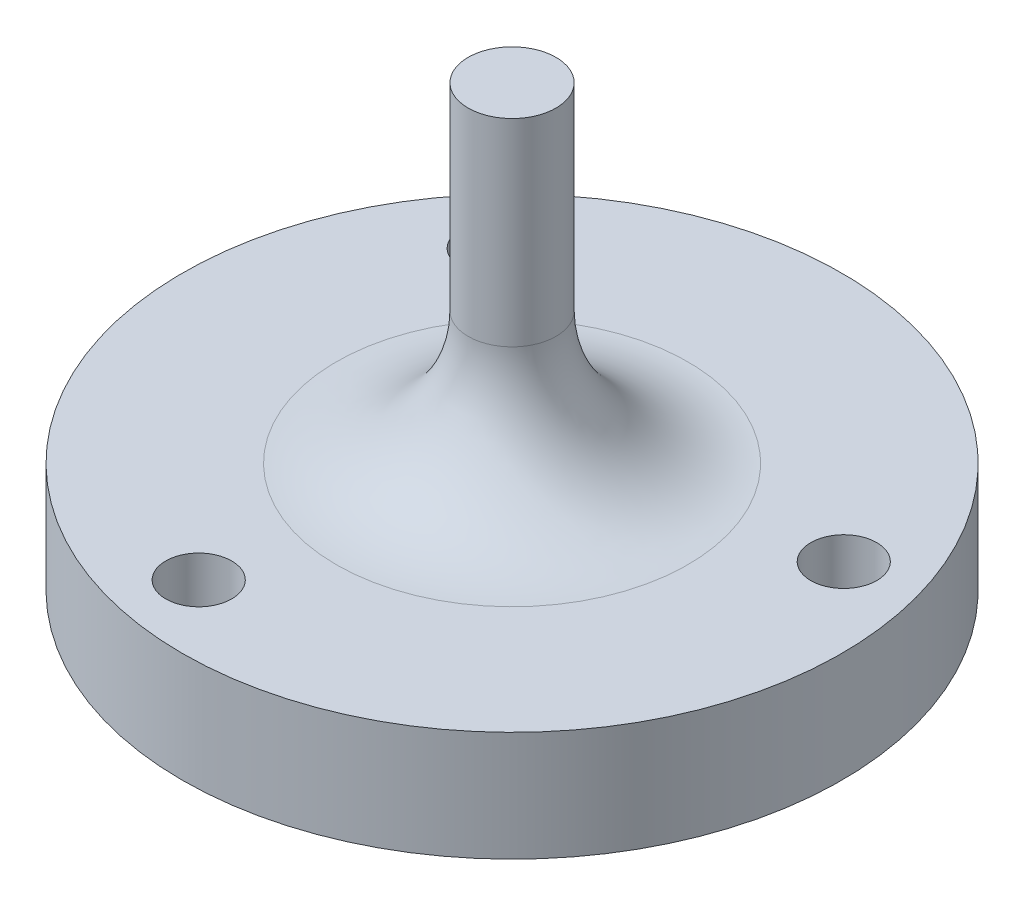
ISO-10303-21;
HEADER;
FILE_DESCRIPTION(('STEP AP214'),'2;1');
FILE_NAME('part.step','',(''),(''),'','','');
FILE_SCHEMA(('AUTOMOTIVE_DESIGN { 1 0 10303 214 1 1 1 1 }'));
ENDSEC;
DATA;
#1=APPLICATION_CONTEXT('core data for automotive mechanical design processes');
#2=APPLICATION_PROTOCOL_DEFINITION('international standard','automotive_design',2000,#1);
#3=PRODUCT_CONTEXT('',#1,'mechanical');
#4=PRODUCT('Part','Part','',(#3));
#5=PRODUCT_RELATED_PRODUCT_CATEGORY('part','',(#4));
#6=PRODUCT_DEFINITION_FORMATION('','',#4);
#7=PRODUCT_DEFINITION_CONTEXT('part definition',#1,'design');
#8=PRODUCT_DEFINITION('design','',#6,#7);
#9=PRODUCT_DEFINITION_SHAPE('','',#8);
#10=(LENGTH_UNIT() NAMED_UNIT(*) SI_UNIT(.MILLI.,.METRE.));
#11=(NAMED_UNIT(*) PLANE_ANGLE_UNIT() SI_UNIT($,.RADIAN.));
#12=(NAMED_UNIT(*) SI_UNIT($,.STERADIAN.) SOLID_ANGLE_UNIT());
#13=UNCERTAINTY_MEASURE_WITH_UNIT(LENGTH_MEASURE(1.E-05),#10,'distance_accuracy_value','');
#14=(GEOMETRIC_REPRESENTATION_CONTEXT(3) GLOBAL_UNCERTAINTY_ASSIGNED_CONTEXT((#13)) GLOBAL_UNIT_ASSIGNED_CONTEXT((#10,
#11,#12)) REPRESENTATION_CONTEXT('',''));
#15=CARTESIAN_POINT('',(0.,0.,0.));
#16=DIRECTION('',(0.,0.,1.));
#17=DIRECTION('',(1.,0.,0.));
#18=AXIS2_PLACEMENT_3D('',#15,#16,#17);
#19=CARTESIAN_POINT('',(0.,5.,0.));
#20=DIRECTION('',(0.,-1.,0.));
#21=DIRECTION('',(0.,0.,-1.));
#22=AXIS2_PLACEMENT_3D('',#19,#20,#21);
#23=CYLINDRICAL_SURFACE('',#22,15.);
#24=CARTESIAN_POINT('',(0.,5.,0.));
#25=DIRECTION('',(0.,1.,0.));
#26=DIRECTION('',(0.,0.,1.));
#27=AXIS2_PLACEMENT_3D('',#24,#25,#26);
#28=CIRCLE('',#27,15.);
#29=CARTESIAN_POINT('',(0.,5.,15.));
#30=VERTEX_POINT('',#29);
#31=EDGE_CURVE('E42',#30,#30,#28,.T.);
#32=ORIENTED_EDGE('',*,*,#31,.F.);
#33=EDGE_LOOP('',(#32));
#34=FACE_BOUND('',#33,.T.);
#35=CARTESIAN_POINT('',(0.,0.,0.));
#36=DIRECTION('',(0.,1.,0.));
#37=DIRECTION('',(0.,0.,1.));
#38=AXIS2_PLACEMENT_3D('',#35,#36,#37);
#39=CIRCLE('',#38,15.);
#40=CARTESIAN_POINT('',(0.,0.,15.));
#41=VERTEX_POINT('',#40);
#42=EDGE_CURVE('E46',#41,#41,#39,.T.);
#43=ORIENTED_EDGE('',*,*,#42,.T.);
#44=EDGE_LOOP('',(#43));
#45=FACE_BOUND('',#44,.T.);
#46=ADVANCED_FACE('F31',(#34,#45),#23,.T.);
#47=CARTESIAN_POINT('',(0.,5.,0.));
#48=DIRECTION('',(0.,1.,0.));
#49=DIRECTION('',(0.,0.,1.));
#50=AXIS2_PLACEMENT_3D('',#47,#48,#49);
#51=PLANE('',#50);
#52=CARTESIAN_POINT('',(-8.89226860724913,5.,-8.05776389679741));
#53=DIRECTION('',(0.,1.,0.));
#54=DIRECTION('',(-0.866025403784436,0.,-0.500000000000004));
#55=AXIS2_PLACEMENT_3D('',#52,#53,#54);
#56=CIRCLE('',#55,1.5);
#57=CARTESIAN_POINT('',(-10.1913067129258,5.,-8.80776389679741));
#58=VERTEX_POINT('',#57);
#59=EDGE_CURVE('E67',#58,#58,#56,.T.);
#60=ORIENTED_EDGE('',*,*,#59,.F.);
#61=EDGE_LOOP('',(#60));
#62=FACE_BOUND('',#61,.T.);
#63=CARTESIAN_POINT('',(11.4243625359482,5.,-3.67204856275385));
#64=DIRECTION('',(0.,1.,0.));
#65=DIRECTION('',(0.866025403784443,0.,-0.499999999999992));
#66=AXIS2_PLACEMENT_3D('',#63,#64,#65);
#67=CIRCLE('',#66,1.5);
#68=CARTESIAN_POINT('',(12.7234006416249,5.,-4.42204856275384));
#69=VERTEX_POINT('',#68);
#70=EDGE_CURVE('E61',#69,#69,#67,.T.);
#71=ORIENTED_EDGE('',*,*,#70,.F.);
#72=EDGE_LOOP('',(#71));
#73=FACE_BOUND('',#72,.T.);
#74=CARTESIAN_POINT('',(-2.53209392869903,5.,11.7298124595513));
#75=DIRECTION('',(0.,1.,0.));
#76=DIRECTION('',(0.,0.,1.));
#77=AXIS2_PLACEMENT_3D('',#74,#75,#76);
#78=CIRCLE('',#77,1.5);
#79=CARTESIAN_POINT('',(-2.53209392869903,5.,13.2298124595513));
#80=VERTEX_POINT('',#79);
#81=EDGE_CURVE('E55',#80,#80,#78,.T.);
#82=ORIENTED_EDGE('',*,*,#81,.F.);
#83=EDGE_LOOP('',(#82));
#84=FACE_BOUND('',#83,.T.);
#85=CARTESIAN_POINT('',(0.,5.,0.));
#86=DIRECTION('',(0.,1.,0.));
#87=DIRECTION('',(0.,0.,1.));
#88=AXIS2_PLACEMENT_3D('',#85,#86,#87);
#89=CIRCLE('',#88,8.);
#90=CARTESIAN_POINT('',(0.,5.,8.));
#91=VERTEX_POINT('',#90);
#92=EDGE_CURVE('E10',#91,#91,#89,.F.);
#93=ORIENTED_EDGE('',*,*,#92,.T.);
#94=EDGE_LOOP('',(#93));
#95=FACE_BOUND('',#94,.T.);
#96=ORIENTED_EDGE('',*,*,#31,.T.);
#97=EDGE_LOOP('',(#96));
#98=FACE_BOUND('',#97,.T.);
#99=ADVANCED_FACE('F83',(#62,#73,#84,#95,#98),#51,.T.);
#100=CARTESIAN_POINT('',(0.,0.,0.));
#101=DIRECTION('',(0.,1.,0.));
#102=DIRECTION('',(0.,0.,1.));
#103=AXIS2_PLACEMENT_3D('',#100,#101,#102);
#104=PLANE('',#103);
#105=CARTESIAN_POINT('',(-8.89226860724913,0.,-8.05776389679741));
#106=DIRECTION('',(0.,1.,0.));
#107=DIRECTION('',(-0.866025403784436,0.,-0.500000000000004));
#108=AXIS2_PLACEMENT_3D('',#105,#106,#107);
#109=CIRCLE('',#108,1.5);
#110=CARTESIAN_POINT('',(-10.1913067129258,0.,-8.80776389679741));
#111=VERTEX_POINT('',#110);
#112=EDGE_CURVE('E58',#111,#111,#109,.T.);
#113=ORIENTED_EDGE('',*,*,#112,.T.);
#114=EDGE_LOOP('',(#113));
#115=FACE_BOUND('',#114,.T.);
#116=CARTESIAN_POINT('',(11.4243625359482,0.,-3.67204856275385));
#117=DIRECTION('',(0.,1.,0.));
#118=DIRECTION('',(0.866025403784443,0.,-0.499999999999992));
#119=AXIS2_PLACEMENT_3D('',#116,#117,#118);
#120=CIRCLE('',#119,1.5);
#121=CARTESIAN_POINT('',(12.7234006416249,0.,-4.42204856275384));
#122=VERTEX_POINT('',#121);
#123=EDGE_CURVE('E64',#122,#122,#120,.T.);
#124=ORIENTED_EDGE('',*,*,#123,.T.);
#125=EDGE_LOOP('',(#124));
#126=FACE_BOUND('',#125,.T.);
#127=CARTESIAN_POINT('',(-2.53209392869903,0.,11.7298124595513));
#128=DIRECTION('',(0.,1.,0.));
#129=DIRECTION('',(0.,0.,1.));
#130=AXIS2_PLACEMENT_3D('',#127,#128,#129);
#131=CIRCLE('',#130,1.5);
#132=CARTESIAN_POINT('',(-2.53209392869903,0.,13.2298124595513));
#133=VERTEX_POINT('',#132);
#134=EDGE_CURVE('E54',#133,#133,#131,.T.);
#135=ORIENTED_EDGE('',*,*,#134,.T.);
#136=EDGE_LOOP('',(#135));
#137=FACE_BOUND('',#136,.T.);
#138=ORIENTED_EDGE('',*,*,#42,.F.);
#139=EDGE_LOOP('',(#138));
#140=FACE_BOUND('',#139,.T.);
#141=ADVANCED_FACE('F73',(#115,#126,#137,#140),#104,.F.);
#142=CARTESIAN_POINT('',(0.,20.,0.));
#143=DIRECTION('',(0.,-1.,0.));
#144=DIRECTION('',(0.,0.,-1.));
#145=AXIS2_PLACEMENT_3D('',#142,#143,#144);
#146=CYLINDRICAL_SURFACE('',#145,2.);
#147=CARTESIAN_POINT('',(0.,11.,0.));
#148=DIRECTION('',(0.,1.,0.));
#149=DIRECTION('',(0.,0.,1.));
#150=AXIS2_PLACEMENT_3D('',#147,#148,#149);
#151=CIRCLE('',#150,2.);
#152=CARTESIAN_POINT('',(0.,11.,2.));
#153=VERTEX_POINT('',#152);
#154=EDGE_CURVE('E38',#153,#153,#151,.T.);
#155=ORIENTED_EDGE('',*,*,#154,.T.);
#156=EDGE_LOOP('',(#155));
#157=FACE_BOUND('',#156,.T.);
#158=CARTESIAN_POINT('',(0.,20.,0.));
#159=DIRECTION('',(0.,1.,0.));
#160=DIRECTION('',(0.,0.,1.));
#161=AXIS2_PLACEMENT_3D('',#158,#159,#160);
#162=CIRCLE('',#161,2.);
#163=CARTESIAN_POINT('',(0.,20.,2.));
#164=VERTEX_POINT('',#163);
#165=EDGE_CURVE('E50',#164,#164,#162,.T.);
#166=ORIENTED_EDGE('',*,*,#165,.F.);
#167=EDGE_LOOP('',(#166));
#168=FACE_BOUND('',#167,.T.);
#169=ADVANCED_FACE('F98',(#157,#168),#146,.T.);
#170=CARTESIAN_POINT('',(0.,20.,0.));
#171=DIRECTION('',(0.,1.,0.));
#172=DIRECTION('',(0.,0.,1.));
#173=AXIS2_PLACEMENT_3D('',#170,#171,#172);
#174=PLANE('',#173);
#175=ORIENTED_EDGE('',*,*,#165,.T.);
#176=EDGE_LOOP('',(#175));
#177=FACE_BOUND('',#176,.T.);
#178=ADVANCED_FACE('F104',(#177),#174,.T.);
#179=CARTESIAN_POINT('',(0.,11.,0.));
#180=DIRECTION('',(0.,1.,0.));
#181=DIRECTION('',(0.,0.,1.));
#182=AXIS2_PLACEMENT_3D('',#179,#180,#181);
#183=TOROIDAL_SURFACE('',#182,8.,6.);
#184=ORIENTED_EDGE('',*,*,#92,.F.);
#185=EDGE_LOOP('',(#184));
#186=FACE_BOUND('',#185,.T.);
#187=ORIENTED_EDGE('',*,*,#154,.F.);
#188=EDGE_LOOP('',(#187));
#189=FACE_BOUND('',#188,.T.);
#190=ADVANCED_FACE('F33',(#186,#189),#183,.F.);
#191=CARTESIAN_POINT('',(-2.53209392869903,0.,11.7298124595513));
#192=DIRECTION('',(0.,1.,0.));
#193=DIRECTION('',(0.,0.,1.));
#194=AXIS2_PLACEMENT_3D('',#191,#192,#193);
#195=CYLINDRICAL_SURFACE('',#194,1.5);
#196=ORIENTED_EDGE('',*,*,#134,.F.);
#197=EDGE_LOOP('',(#196));
#198=FACE_BOUND('',#197,.T.);
#199=ORIENTED_EDGE('',*,*,#81,.T.);
#200=EDGE_LOOP('',(#199));
#201=FACE_BOUND('',#200,.T.);
#202=ADVANCED_FACE('F110',(#198,#201),#195,.F.);
#203=CARTESIAN_POINT('',(11.4243625359482,0.,-3.67204856275385));
#204=DIRECTION('',(0.,1.,0.));
#205=DIRECTION('',(0.,0.,1.));
#206=AXIS2_PLACEMENT_3D('',#203,#204,#205);
#207=CYLINDRICAL_SURFACE('',#206,1.5);
#208=ORIENTED_EDGE('',*,*,#123,.F.);
#209=EDGE_LOOP('',(#208));
#210=FACE_BOUND('',#209,.T.);
#211=ORIENTED_EDGE('',*,*,#70,.T.);
#212=EDGE_LOOP('',(#211));
#213=FACE_BOUND('',#212,.T.);
#214=ADVANCED_FACE('F79',(#210,#213),#207,.F.);
#215=CARTESIAN_POINT('',(-8.89226860724913,0.,-8.05776389679741));
#216=DIRECTION('',(0.,1.,0.));
#217=DIRECTION('',(0.,0.,1.));
#218=AXIS2_PLACEMENT_3D('',#215,#216,#217);
#219=CYLINDRICAL_SURFACE('',#218,1.5);
#220=ORIENTED_EDGE('',*,*,#112,.F.);
#221=EDGE_LOOP('',(#220));
#222=FACE_BOUND('',#221,.T.);
#223=ORIENTED_EDGE('',*,*,#59,.T.);
#224=EDGE_LOOP('',(#223));
#225=FACE_BOUND('',#224,.T.);
#226=ADVANCED_FACE('F76',(#222,#225),#219,.F.);
#227=CLOSED_SHELL('',(#46,#99,#141,#169,#178,#190,#202,#214,#226));
#228=MANIFOLD_SOLID_BREP('B2',#227);
#229=ADVANCED_BREP_SHAPE_REPRESENTATION('',(#18,#228),#14);
#230=SHAPE_DEFINITION_REPRESENTATION(#9,#229);
ENDSEC;
END-ISO-10303-21;
